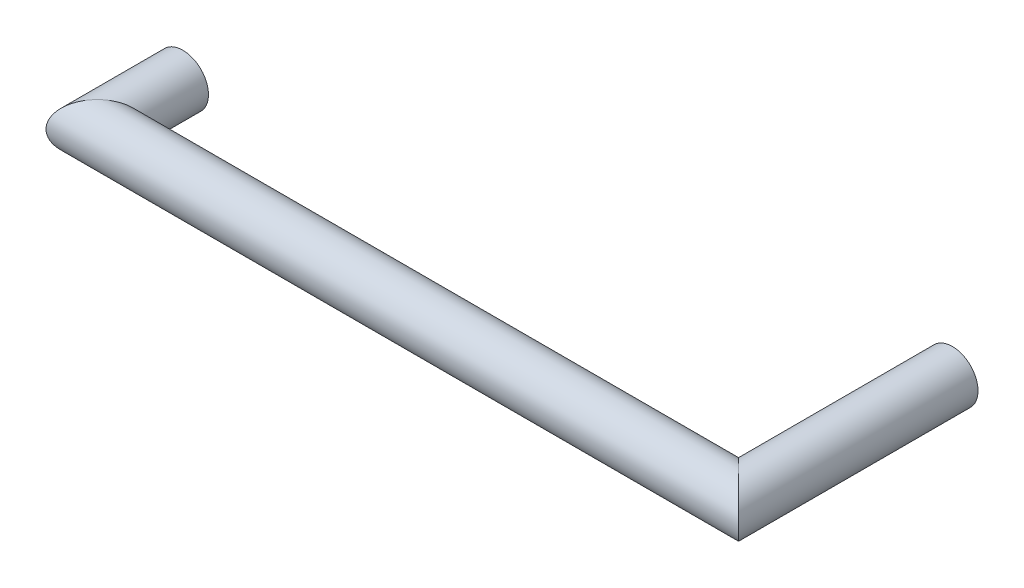
ISO-10303-21;
HEADER;
FILE_DESCRIPTION(('STEP AP214'),'2;1');
FILE_NAME('part.step','',(''),(''),'','','');
FILE_SCHEMA(('AUTOMOTIVE_DESIGN { 1 0 10303 214 1 1 1 1 }'));
ENDSEC;
DATA;
#1=APPLICATION_CONTEXT('core data for automotive mechanical design processes');
#2=APPLICATION_PROTOCOL_DEFINITION('international standard','automotive_design',2000,#1);
#3=PRODUCT_CONTEXT('',#1,'mechanical');
#4=PRODUCT('Part','Part','',(#3));
#5=PRODUCT_RELATED_PRODUCT_CATEGORY('part','',(#4));
#6=PRODUCT_DEFINITION_FORMATION('','',#4);
#7=PRODUCT_DEFINITION_CONTEXT('part definition',#1,'design');
#8=PRODUCT_DEFINITION('design','',#6,#7);
#9=PRODUCT_DEFINITION_SHAPE('','',#8);
#10=(LENGTH_UNIT() NAMED_UNIT(*) SI_UNIT(.MILLI.,.METRE.));
#11=(NAMED_UNIT(*) PLANE_ANGLE_UNIT() SI_UNIT($,.RADIAN.));
#12=(NAMED_UNIT(*) SI_UNIT($,.STERADIAN.) SOLID_ANGLE_UNIT());
#13=UNCERTAINTY_MEASURE_WITH_UNIT(LENGTH_MEASURE(1.E-05),#10,'distance_accuracy_value','');
#14=(GEOMETRIC_REPRESENTATION_CONTEXT(3) GLOBAL_UNCERTAINTY_ASSIGNED_CONTEXT((#13)) GLOBAL_UNIT_ASSIGNED_CONTEXT((#10,
#11,#12)) REPRESENTATION_CONTEXT('',''));
#15=CARTESIAN_POINT('',(0.,0.,0.));
#16=DIRECTION('',(0.,0.,1.));
#17=DIRECTION('',(1.,0.,0.));
#18=AXIS2_PLACEMENT_3D('',#15,#16,#17);
#19=CARTESIAN_POINT('',(-7.5,0.,-2.));
#20=DIRECTION('',(0.,0.,-1.));
#21=DIRECTION('',(-1.,0.,0.));
#22=AXIS2_PLACEMENT_3D('',#19,#20,#21);
#23=PLANE('',#22);
#24=CARTESIAN_POINT('',(-7.5,0.,-2.));
#25=DIRECTION('',(0.,0.,-1.));
#26=DIRECTION('',(-1.,0.,0.));
#27=AXIS2_PLACEMENT_3D('',#24,#25,#26);
#28=CIRCLE('',#27,0.6);
#29=CARTESIAN_POINT('',(-8.1,0.,-2.));
#30=VERTEX_POINT('',#29);
#31=EDGE_CURVE('E40',#30,#30,#28,.T.);
#32=ORIENTED_EDGE('',*,*,#31,.T.);
#33=EDGE_LOOP('',(#32));
#34=FACE_BOUND('',#33,.T.);
#35=ADVANCED_FACE('F37',(#34),#23,.T.);
#36=CARTESIAN_POINT('',(7.5,0.,-5.));
#37=DIRECTION('',(0.,0.,1.));
#38=DIRECTION('',(1.,0.,0.));
#39=AXIS2_PLACEMENT_3D('',#36,#37,#38);
#40=PLANE('',#39);
#41=CARTESIAN_POINT('',(7.5,0.,-5.));
#42=DIRECTION('',(0.,0.,1.));
#43=DIRECTION('',(1.,0.,0.));
#44=AXIS2_PLACEMENT_3D('',#41,#42,#43);
#45=CIRCLE('',#44,0.6);
#46=CARTESIAN_POINT('',(8.1,0.,-5.));
#47=VERTEX_POINT('',#46);
#48=EDGE_CURVE('E45',#47,#47,#45,.T.);
#49=ORIENTED_EDGE('',*,*,#48,.F.);
#50=EDGE_LOOP('',(#49));
#51=FACE_BOUND('',#50,.T.);
#52=ADVANCED_FACE('F65',(#51),#40,.F.);
#53=CARTESIAN_POINT('',(-7.5,0.,0.76));
#54=DIRECTION('',(0.,0.,-1.));
#55=DIRECTION('',(-1.,0.,0.));
#56=AXIS2_PLACEMENT_3D('',#53,#54,#55);
#57=CYLINDRICAL_SURFACE('',#56,0.6);
#58=CARTESIAN_POINT('',(-7.5,0.,0.));
#59=DIRECTION('',(-0.707106781186548,0.,-0.707106781186547));
#60=DIRECTION('',(-0.707106781186547,0.,0.707106781186548));
#61=AXIS2_PLACEMENT_3D('',#58,#59,#60);
#62=ELLIPSE('',#61,0.848528137423857,0.6);
#63=CARTESIAN_POINT('',(-8.1,0.,0.600000000000001));
#64=VERTEX_POINT('',#63);
#65=EDGE_CURVE('E51',#64,#64,#62,.F.);
#66=ORIENTED_EDGE('',*,*,#65,.F.);
#67=EDGE_LOOP('',(#66));
#68=FACE_BOUND('',#67,.T.);
#69=ORIENTED_EDGE('',*,*,#31,.F.);
#70=EDGE_LOOP('',(#69));
#71=FACE_BOUND('',#70,.T.);
#72=ADVANCED_FACE('F62',(#68,#71),#57,.T.);
#73=CARTESIAN_POINT('',(8.26,0.,0.));
#74=DIRECTION('',(-1.,0.,0.));
#75=DIRECTION('',(0.,0.,1.));
#76=AXIS2_PLACEMENT_3D('',#73,#74,#75);
#77=CYLINDRICAL_SURFACE('',#76,0.6);
#78=CARTESIAN_POINT('',(7.5,0.,0.));
#79=DIRECTION('',(-0.707106781186547,0.,0.707106781186548));
#80=DIRECTION('',(0.707106781186548,0.,0.707106781186547));
#81=AXIS2_PLACEMENT_3D('',#78,#79,#80);
#82=ELLIPSE('',#81,0.848528137423857,0.6);
#83=CARTESIAN_POINT('',(8.1,0.,0.599999999999998));
#84=VERTEX_POINT('',#83);
#85=EDGE_CURVE('E10',#84,#84,#82,.F.);
#86=ORIENTED_EDGE('',*,*,#85,.F.);
#87=EDGE_LOOP('',(#86));
#88=FACE_BOUND('',#87,.T.);
#89=ORIENTED_EDGE('',*,*,#65,.T.);
#90=EDGE_LOOP('',(#89));
#91=FACE_BOUND('',#90,.T.);
#92=ADVANCED_FACE('F64',(#88,#91),#77,.T.);
#93=CARTESIAN_POINT('',(7.5,0.,-5.));
#94=DIRECTION('',(0.,0.,1.));
#95=DIRECTION('',(1.,0.,0.));
#96=AXIS2_PLACEMENT_3D('',#93,#94,#95);
#97=CYLINDRICAL_SURFACE('',#96,0.6);
#98=ORIENTED_EDGE('',*,*,#48,.T.);
#99=EDGE_LOOP('',(#98));
#100=FACE_BOUND('',#99,.T.);
#101=ORIENTED_EDGE('',*,*,#85,.T.);
#102=EDGE_LOOP('',(#101));
#103=FACE_BOUND('',#102,.T.);
#104=ADVANCED_FACE('F72',(#100,#103),#97,.T.);
#105=CLOSED_SHELL('',(#35,#52,#72,#92,#104));
#106=MANIFOLD_SOLID_BREP('B2',#105);
#107=ADVANCED_BREP_SHAPE_REPRESENTATION('',(#18,#106),#14);
#108=SHAPE_DEFINITION_REPRESENTATION(#9,#107);
ENDSEC;
END-ISO-10303-21;
